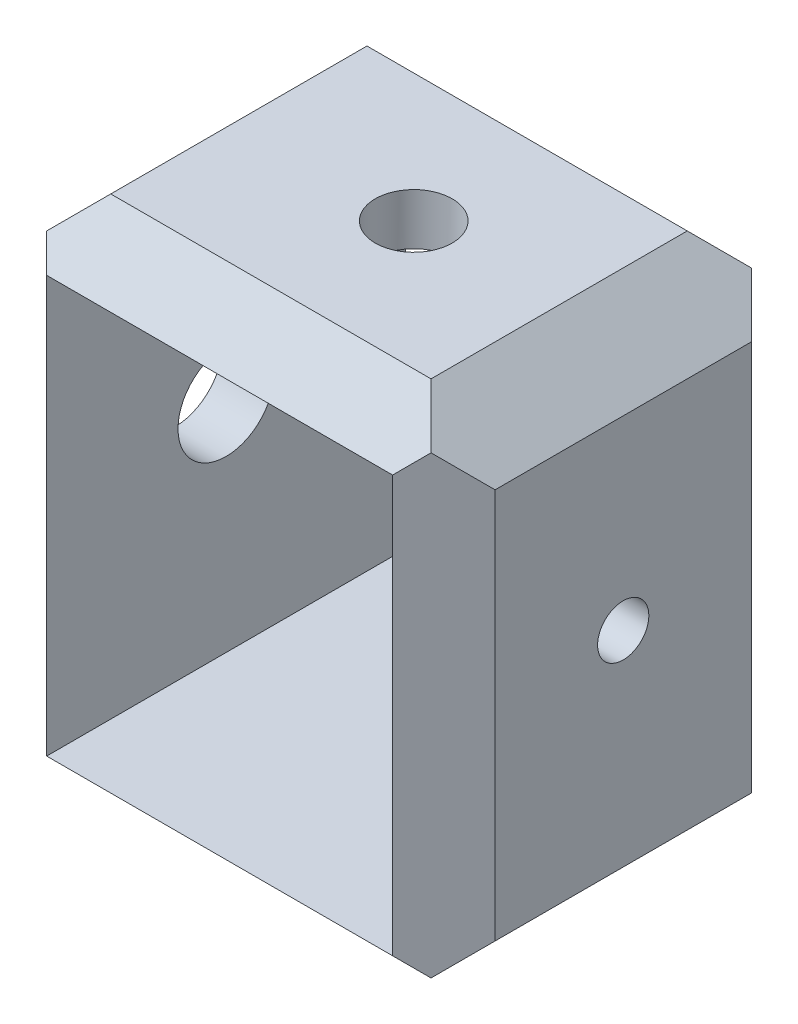
ISO-10303-21;
HEADER;
FILE_DESCRIPTION(('STEP AP214'),'2;1');
FILE_NAME('part.step','',(''),(''),'','','');
FILE_SCHEMA(('AUTOMOTIVE_DESIGN { 1 0 10303 214 1 1 1 1 }'));
ENDSEC;
DATA;
#1=APPLICATION_CONTEXT('core data for automotive mechanical design processes');
#2=APPLICATION_PROTOCOL_DEFINITION('international standard','automotive_design',2000,#1);
#3=PRODUCT_CONTEXT('',#1,'mechanical');
#4=PRODUCT('Part','Part','',(#3));
#5=PRODUCT_RELATED_PRODUCT_CATEGORY('part','',(#4));
#6=PRODUCT_DEFINITION_FORMATION('','',#4);
#7=PRODUCT_DEFINITION_CONTEXT('part definition',#1,'design');
#8=PRODUCT_DEFINITION('design','',#6,#7);
#9=PRODUCT_DEFINITION_SHAPE('','',#8);
#10=(LENGTH_UNIT() NAMED_UNIT(*) SI_UNIT(.MILLI.,.METRE.));
#11=(NAMED_UNIT(*) PLANE_ANGLE_UNIT() SI_UNIT($,.RADIAN.));
#12=(NAMED_UNIT(*) SI_UNIT($,.STERADIAN.) SOLID_ANGLE_UNIT());
#13=UNCERTAINTY_MEASURE_WITH_UNIT(LENGTH_MEASURE(1.E-05),#10,'distance_accuracy_value','');
#14=(GEOMETRIC_REPRESENTATION_CONTEXT(3) GLOBAL_UNCERTAINTY_ASSIGNED_CONTEXT((#13)) GLOBAL_UNIT_ASSIGNED_CONTEXT((#10,
#11,#12)) REPRESENTATION_CONTEXT('',''));
#15=CARTESIAN_POINT('',(0.,0.,0.));
#16=DIRECTION('',(0.,0.,1.));
#17=DIRECTION('',(1.,0.,0.));
#18=AXIS2_PLACEMENT_3D('',#15,#16,#17);
#19=CARTESIAN_POINT('',(-132.607692058621,195.,150.));
#20=DIRECTION('',(1.,0.,0.));
#21=DIRECTION('',(0.,1.,0.));
#22=AXIS2_PLACEMENT_3D('',#19,#20,#21);
#23=PLANE('',#22);
#24=CARTESIAN_POINT('',(-132.607692058621,0.,0.));
#25=DIRECTION('',(-1.,0.,0.));
#26=DIRECTION('',(0.,-1.,0.));
#27=AXIS2_PLACEMENT_3D('',#24,#25,#26);
#28=CIRCLE('',#27,37.5);
#29=CARTESIAN_POINT('',(-132.607692058621,-37.5,0.));
#30=VERTEX_POINT('',#29);
#31=EDGE_CURVE('E310',#30,#30,#28,.T.);
#32=ORIENTED_EDGE('',*,*,#31,.F.);
#33=EDGE_LOOP('',(#32));
#34=FACE_BOUND('',#33,.T.);
#35=DIRECTION('',(0.,0.,1.));
#36=VECTOR('',#35,1.);
#37=CARTESIAN_POINT('',(-132.607692058621,-160.,150.));
#38=LINE('',#37,#36);
#39=CARTESIAN_POINT('',(-132.607692058621,-160.,-99.9999999999991));
#40=VERTEX_POINT('',#39);
#41=CARTESIAN_POINT('',(-132.607692058621,-160.,99.9999999999996));
#42=VERTEX_POINT('',#41);
#43=EDGE_CURVE('E179',#40,#42,#38,.T.);
#44=ORIENTED_EDGE('',*,*,#43,.T.);
#45=DIRECTION('',(0.,1.,0.));
#46=VECTOR('',#45,1.);
#47=CARTESIAN_POINT('',(-132.607692058621,145.,99.9999999999996));
#48=LINE('',#47,#46);
#49=CARTESIAN_POINT('',(-132.607692058621,145.,99.9999999999996));
#50=VERTEX_POINT('',#49);
#51=EDGE_CURVE('E262',#42,#50,#48,.T.);
#52=ORIENTED_EDGE('',*,*,#51,.T.);
#53=DIRECTION('',(0.,0.,-1.));
#54=VECTOR('',#53,1.);
#55=CARTESIAN_POINT('',(-132.607692058621,145.,150.));
#56=LINE('',#55,#54);
#57=CARTESIAN_POINT('',(-132.607692058621,145.,-99.9999999999991));
#58=VERTEX_POINT('',#57);
#59=EDGE_CURVE('E177',#50,#58,#56,.T.);
#60=ORIENTED_EDGE('',*,*,#59,.T.);
#61=DIRECTION('',(0.,-1.,0.));
#62=VECTOR('',#61,1.);
#63=CARTESIAN_POINT('',(-132.607692058621,195.,-99.9999999999991));
#64=LINE('',#63,#62);
#65=EDGE_CURVE('E259',#58,#40,#64,.T.);
#66=ORIENTED_EDGE('',*,*,#65,.T.);
#67=EDGE_LOOP('',(#44,#52,#60,#66));
#68=FACE_BOUND('',#67,.T.);
#69=ADVANCED_FACE('F37',(#34,#68),#23,.F.);
#70=CARTESIAN_POINT('',(-132.607692058621,-210.,150.));
#71=DIRECTION('',(0.,1.,0.));
#72=DIRECTION('',(0.,0.,1.));
#73=AXIS2_PLACEMENT_3D('',#70,#71,#72);
#74=PLANE('',#73);
#75=DIRECTION('',(0.,0.,-1.));
#76=VECTOR('',#75,1.);
#77=CARTESIAN_POINT('',(-82.6076920586205,-210.,150.));
#78=LINE('',#77,#76);
#79=CARTESIAN_POINT('',(-82.6076920586205,-210.,99.9999999999996));
#80=VERTEX_POINT('',#79);
#81=CARTESIAN_POINT('',(-82.6076920586205,-210.,-99.9999999999991));
#82=VERTEX_POINT('',#81);
#83=EDGE_CURVE('E171',#80,#82,#78,.T.);
#84=ORIENTED_EDGE('',*,*,#83,.T.);
#85=DIRECTION('',(1.,0.,0.));
#86=VECTOR('',#85,1.);
#87=CARTESIAN_POINT('',(-132.607692058621,-210.,-99.9999999999991));
#88=LINE('',#87,#86);
#89=CARTESIAN_POINT('',(167.392307941379,-210.,-99.9999999999991));
#90=VERTEX_POINT('',#89);
#91=EDGE_CURVE('E154',#82,#90,#88,.T.);
#92=ORIENTED_EDGE('',*,*,#91,.T.);
#93=DIRECTION('',(0.,0.,1.));
#94=VECTOR('',#93,1.);
#95=CARTESIAN_POINT('',(167.392307941379,-210.,150.));
#96=LINE('',#95,#94);
#97=CARTESIAN_POINT('',(167.392307941379,-210.,99.9999999999996));
#98=VERTEX_POINT('',#97);
#99=EDGE_CURVE('E168',#90,#98,#96,.T.);
#100=ORIENTED_EDGE('',*,*,#99,.T.);
#101=DIRECTION('',(-1.,0.,0.));
#102=VECTOR('',#101,1.);
#103=CARTESIAN_POINT('',(-82.6076920586205,-210.,99.9999999999996));
#104=LINE('',#103,#102);
#105=EDGE_CURVE('E172',#98,#80,#104,.T.);
#106=ORIENTED_EDGE('',*,*,#105,.T.);
#107=EDGE_LOOP('',(#84,#92,#100,#106));
#108=FACE_BOUND('',#107,.T.);
#109=ADVANCED_FACE('F167',(#108),#74,.F.);
#110=CARTESIAN_POINT('',(217.392307941379,195.,150.));
#111=DIRECTION('',(-1.,0.,0.));
#112=DIRECTION('',(0.,-1.,0.));
#113=AXIS2_PLACEMENT_3D('',#110,#111,#112);
#114=PLANE('',#113);
#115=CARTESIAN_POINT('',(217.392307941379,0.,0.));
#116=DIRECTION('',(1.,0.,0.));
#117=DIRECTION('',(0.,1.,0.));
#118=AXIS2_PLACEMENT_3D('',#115,#116,#117);
#119=CIRCLE('',#118,20.);
#120=CARTESIAN_POINT('',(217.392307941379,20.,0.));
#121=VERTEX_POINT('',#120);
#122=EDGE_CURVE('E316',#121,#121,#119,.T.);
#123=ORIENTED_EDGE('',*,*,#122,.F.);
#124=EDGE_LOOP('',(#123));
#125=FACE_BOUND('',#124,.T.);
#126=DIRECTION('',(0.,0.,1.));
#127=VECTOR('',#126,1.);
#128=CARTESIAN_POINT('',(217.392307941379,145.,150.));
#129=LINE('',#128,#127);
#130=CARTESIAN_POINT('',(217.392307941379,145.,-99.9999999999991));
#131=VERTEX_POINT('',#130);
#132=CARTESIAN_POINT('',(217.392307941379,145.,99.9999999999996));
#133=VERTEX_POINT('',#132);
#134=EDGE_CURVE('E300',#131,#133,#129,.T.);
#135=ORIENTED_EDGE('',*,*,#134,.T.);
#136=DIRECTION('',(0.,-1.,0.));
#137=VECTOR('',#136,1.);
#138=CARTESIAN_POINT('',(217.392307941379,-160.,99.9999999999996));
#139=LINE('',#138,#137);
#140=CARTESIAN_POINT('',(217.392307941379,-160.,99.9999999999996));
#141=VERTEX_POINT('',#140);
#142=EDGE_CURVE('E240',#133,#141,#139,.T.);
#143=ORIENTED_EDGE('',*,*,#142,.T.);
#144=DIRECTION('',(0.,0.,-1.));
#145=VECTOR('',#144,1.);
#146=CARTESIAN_POINT('',(217.392307941379,-160.,150.));
#147=LINE('',#146,#145);
#148=CARTESIAN_POINT('',(217.392307941379,-160.,-99.9999999999991));
#149=VERTEX_POINT('',#148);
#150=EDGE_CURVE('E181',#141,#149,#147,.T.);
#151=ORIENTED_EDGE('',*,*,#150,.T.);
#152=DIRECTION('',(0.,1.,0.));
#153=VECTOR('',#152,1.);
#154=CARTESIAN_POINT('',(217.392307941379,195.,-99.9999999999991));
#155=LINE('',#154,#153);
#156=EDGE_CURVE('E237',#149,#131,#155,.T.);
#157=ORIENTED_EDGE('',*,*,#156,.T.);
#158=EDGE_LOOP('',(#135,#143,#151,#157));
#159=FACE_BOUND('',#158,.T.);
#160=ADVANCED_FACE('F297',(#125,#159),#114,.F.);
#161=CARTESIAN_POINT('',(-132.607692058621,195.,150.));
#162=DIRECTION('',(0.,-1.,0.));
#163=DIRECTION('',(1.,0.,0.));
#164=AXIS2_PLACEMENT_3D('',#161,#162,#163);
#165=PLANE('',#164);
#166=CARTESIAN_POINT('',(53.8823079413794,195.,0.));
#167=DIRECTION('',(0.,1.,0.));
#168=DIRECTION('',(0.,0.,1.));
#169=AXIS2_PLACEMENT_3D('',#166,#167,#168);
#170=CIRCLE('',#169,30.);
#171=CARTESIAN_POINT('',(53.8823079413794,195.,30.));
#172=VERTEX_POINT('',#171);
#173=EDGE_CURVE('E322',#172,#172,#170,.T.);
#174=ORIENTED_EDGE('',*,*,#173,.F.);
#175=EDGE_LOOP('',(#174));
#176=FACE_BOUND('',#175,.T.);
#177=DIRECTION('',(0.,0.,-1.));
#178=VECTOR('',#177,1.);
#179=CARTESIAN_POINT('',(167.392307941379,195.,150.));
#180=LINE('',#179,#178);
#181=CARTESIAN_POINT('',(167.392307941379,195.,99.9999999999996));
#182=VERTEX_POINT('',#181);
#183=CARTESIAN_POINT('',(167.392307941379,195.,-99.9999999999991));
#184=VERTEX_POINT('',#183);
#185=EDGE_CURVE('E190',#182,#184,#180,.T.);
#186=ORIENTED_EDGE('',*,*,#185,.T.);
#187=DIRECTION('',(-1.,0.,0.));
#188=VECTOR('',#187,1.);
#189=CARTESIAN_POINT('',(-132.607692058621,195.,-99.9999999999991));
#190=LINE('',#189,#188);
#191=CARTESIAN_POINT('',(-82.6076920586204,195.,-99.9999999999991));
#192=VERTEX_POINT('',#191);
#193=EDGE_CURVE('E207',#184,#192,#190,.T.);
#194=ORIENTED_EDGE('',*,*,#193,.T.);
#195=DIRECTION('',(0.,0.,1.));
#196=VECTOR('',#195,1.);
#197=CARTESIAN_POINT('',(-82.6076920586204,195.,150.));
#198=LINE('',#197,#196);
#199=CARTESIAN_POINT('',(-82.6076920586204,195.,99.9999999999996));
#200=VERTEX_POINT('',#199);
#201=EDGE_CURVE('E187',#192,#200,#198,.T.);
#202=ORIENTED_EDGE('',*,*,#201,.T.);
#203=DIRECTION('',(1.,0.,0.));
#204=VECTOR('',#203,1.);
#205=CARTESIAN_POINT('',(167.392307941379,195.,99.9999999999996));
#206=LINE('',#205,#204);
#207=EDGE_CURVE('E205',#200,#182,#206,.T.);
#208=ORIENTED_EDGE('',*,*,#207,.T.);
#209=EDGE_LOOP('',(#186,#194,#202,#208));
#210=FACE_BOUND('',#209,.T.);
#211=ADVANCED_FACE('F329',(#176,#210),#165,.F.);
#212=CARTESIAN_POINT('',(-92.6076920586205,155.,150.));
#213=DIRECTION('',(0.,-1.,0.));
#214=DIRECTION('',(0.,0.,-1.));
#215=AXIS2_PLACEMENT_3D('',#212,#213,#214);
#216=PLANE('',#215);
#217=CARTESIAN_POINT('',(53.8823079413794,155.,0.));
#218=DIRECTION('',(0.,-1.,0.));
#219=DIRECTION('',(0.,0.,-1.));
#220=AXIS2_PLACEMENT_3D('',#217,#218,#219);
#221=CIRCLE('',#220,30.);
#222=CARTESIAN_POINT('',(53.8823079413794,155.,-30.));
#223=VERTEX_POINT('',#222);
#224=EDGE_CURVE('E319',#223,#223,#221,.F.);
#225=ORIENTED_EDGE('',*,*,#224,.T.);
#226=EDGE_LOOP('',(#225));
#227=FACE_BOUND('',#226,.T.);
#228=DIRECTION('',(0.,0.,-1.));
#229=VECTOR('',#228,1.);
#230=CARTESIAN_POINT('',(-92.6076920586205,155.,150.));
#231=LINE('',#230,#229);
#232=CARTESIAN_POINT('',(-92.6076920586205,155.,139.999999999999));
#233=VERTEX_POINT('',#232);
#234=CARTESIAN_POINT('',(-92.6076920586205,155.,-140.));
#235=VERTEX_POINT('',#234);
#236=EDGE_CURVE('E284',#233,#235,#231,.T.);
#237=ORIENTED_EDGE('',*,*,#236,.T.);
#238=DIRECTION('',(-1.,0.,0.));
#239=VECTOR('',#238,1.);
#240=CARTESIAN_POINT('',(-92.6076920586205,155.,-140.));
#241=LINE('',#240,#239);
#242=CARTESIAN_POINT('',(177.392307941379,155.,-139.999999999999));
#243=VERTEX_POINT('',#242);
#244=EDGE_CURVE('E217',#235,#243,#241,.F.);
#245=ORIENTED_EDGE('',*,*,#244,.T.);
#246=DIRECTION('',(0.,0.,-1.));
#247=VECTOR('',#246,1.);
#248=CARTESIAN_POINT('',(177.392307941379,155.,150.));
#249=LINE('',#248,#247);
#250=CARTESIAN_POINT('',(177.392307941379,155.,139.999999999999));
#251=VERTEX_POINT('',#250);
#252=EDGE_CURVE('E281',#251,#243,#249,.T.);
#253=ORIENTED_EDGE('',*,*,#252,.F.);
#254=DIRECTION('',(-1.,0.,0.));
#255=VECTOR('',#254,1.);
#256=CARTESIAN_POINT('',(-92.6076920586205,155.,139.999999999999));
#257=LINE('',#256,#255);
#258=EDGE_CURVE('E214',#251,#233,#257,.T.);
#259=ORIENTED_EDGE('',*,*,#258,.T.);
#260=EDGE_LOOP('',(#237,#245,#253,#259));
#261=FACE_BOUND('',#260,.T.);
#262=ADVANCED_FACE('F280',(#227,#261),#216,.T.);
#263=CARTESIAN_POINT('',(-92.6076920586205,155.,150.));
#264=DIRECTION('',(1.,0.,0.));
#265=DIRECTION('',(0.,1.,0.));
#266=AXIS2_PLACEMENT_3D('',#263,#264,#265);
#267=PLANE('',#266);
#268=CARTESIAN_POINT('',(-92.6076920586205,0.,0.));
#269=DIRECTION('',(1.,0.,0.));
#270=DIRECTION('',(0.,1.,0.));
#271=AXIS2_PLACEMENT_3D('',#268,#269,#270);
#272=CIRCLE('',#271,37.5);
#273=CARTESIAN_POINT('',(-92.6076920586205,37.5,0.));
#274=VERTEX_POINT('',#273);
#275=EDGE_CURVE('E291',#274,#274,#272,.F.);
#276=ORIENTED_EDGE('',*,*,#275,.T.);
#277=EDGE_LOOP('',(#276));
#278=FACE_BOUND('',#277,.T.);
#279=ORIENTED_EDGE('',*,*,#236,.F.);
#280=DIRECTION('',(0.,-1.,0.));
#281=VECTOR('',#280,1.);
#282=CARTESIAN_POINT('',(-92.6076920586205,155.,139.999999999999));
#283=LINE('',#282,#281);
#284=CARTESIAN_POINT('',(-92.6076920586205,-170.,139.999999999999));
#285=VERTEX_POINT('',#284);
#286=EDGE_CURVE('E253',#233,#285,#283,.T.);
#287=ORIENTED_EDGE('',*,*,#286,.T.);
#288=DIRECTION('',(0.,0.,-1.));
#289=VECTOR('',#288,1.);
#290=CARTESIAN_POINT('',(-92.6076920586205,-170.,150.));
#291=LINE('',#290,#289);
#292=CARTESIAN_POINT('',(-92.6076920586205,-170.,-140.));
#293=VERTEX_POINT('',#292);
#294=EDGE_CURVE('E304',#285,#293,#291,.T.);
#295=ORIENTED_EDGE('',*,*,#294,.T.);
#296=DIRECTION('',(0.,-1.,0.));
#297=VECTOR('',#296,1.);
#298=CARTESIAN_POINT('',(-92.6076920586205,155.,-140.));
#299=LINE('',#298,#297);
#300=EDGE_CURVE('E251',#293,#235,#299,.F.);
#301=ORIENTED_EDGE('',*,*,#300,.T.);
#302=EDGE_LOOP('',(#279,#287,#295,#301));
#303=FACE_BOUND('',#302,.T.);
#304=ADVANCED_FACE('F361',(#278,#303),#267,.T.);
#305=CARTESIAN_POINT('',(-92.6076920586205,-170.,150.));
#306=DIRECTION('',(0.,1.,0.));
#307=DIRECTION('',(-1.,0.,0.));
#308=AXIS2_PLACEMENT_3D('',#305,#306,#307);
#309=PLANE('',#308);
#310=DIRECTION('',(0.,0.,-1.));
#311=VECTOR('',#310,1.);
#312=CARTESIAN_POINT('',(177.392307941379,-170.,150.));
#313=LINE('',#312,#311);
#314=CARTESIAN_POINT('',(177.392307941379,-170.,139.999999999999));
#315=VERTEX_POINT('',#314);
#316=CARTESIAN_POINT('',(177.392307941379,-170.,-140.));
#317=VERTEX_POINT('',#316);
#318=EDGE_CURVE('E290',#315,#317,#313,.T.);
#319=ORIENTED_EDGE('',*,*,#318,.T.);
#320=DIRECTION('',(1.,0.,0.));
#321=VECTOR('',#320,1.);
#322=CARTESIAN_POINT('',(-92.6076920586205,-170.,-140.));
#323=LINE('',#322,#321);
#324=EDGE_CURVE('E197',#317,#293,#323,.F.);
#325=ORIENTED_EDGE('',*,*,#324,.T.);
#326=ORIENTED_EDGE('',*,*,#294,.F.);
#327=DIRECTION('',(1.,0.,0.));
#328=VECTOR('',#327,1.);
#329=CARTESIAN_POINT('',(-92.6076920586205,-170.,139.999999999999));
#330=LINE('',#329,#328);
#331=EDGE_CURVE('E161',#285,#315,#330,.T.);
#332=ORIENTED_EDGE('',*,*,#331,.T.);
#333=EDGE_LOOP('',(#319,#325,#326,#332));
#334=FACE_BOUND('',#333,.T.);
#335=ADVANCED_FACE('F364',(#334),#309,.T.);
#336=CARTESIAN_POINT('',(177.392307941379,155.,150.));
#337=DIRECTION('',(-1.,0.,0.));
#338=DIRECTION('',(0.,-1.,0.));
#339=AXIS2_PLACEMENT_3D('',#336,#337,#338);
#340=PLANE('',#339);
#341=CARTESIAN_POINT('',(177.392307941379,0.,0.));
#342=DIRECTION('',(-1.,0.,0.));
#343=DIRECTION('',(0.,-1.,0.));
#344=AXIS2_PLACEMENT_3D('',#341,#342,#343);
#345=CIRCLE('',#344,20.);
#346=CARTESIAN_POINT('',(177.392307941379,-20.,0.));
#347=VERTEX_POINT('',#346);
#348=EDGE_CURVE('E313',#347,#347,#345,.F.);
#349=ORIENTED_EDGE('',*,*,#348,.T.);
#350=EDGE_LOOP('',(#349));
#351=FACE_BOUND('',#350,.T.);
#352=ORIENTED_EDGE('',*,*,#318,.F.);
#353=DIRECTION('',(0.,1.,0.));
#354=VECTOR('',#353,1.);
#355=CARTESIAN_POINT('',(177.392307941379,155.,139.999999999999));
#356=LINE('',#355,#354);
#357=EDGE_CURVE('E227',#315,#251,#356,.T.);
#358=ORIENTED_EDGE('',*,*,#357,.T.);
#359=ORIENTED_EDGE('',*,*,#252,.T.);
#360=DIRECTION('',(0.,1.,0.));
#361=VECTOR('',#360,1.);
#362=CARTESIAN_POINT('',(177.392307941379,155.,-140.));
#363=LINE('',#362,#361);
#364=EDGE_CURVE('E225',#243,#317,#363,.F.);
#365=ORIENTED_EDGE('',*,*,#364,.T.);
#366=EDGE_LOOP('',(#352,#358,#359,#365));
#367=FACE_BOUND('',#366,.T.);
#368=ADVANCED_FACE('F287',(#351,#367),#340,.T.);
#369=CARTESIAN_POINT('',(13.4583251193616,0.,0.));
#370=DIRECTION('',(-1.,0.,0.));
#371=DIRECTION('',(0.,-1.,0.));
#372=AXIS2_PLACEMENT_3D('',#369,#370,#371);
#373=CYLINDRICAL_SURFACE('',#372,37.5);
#374=ORIENTED_EDGE('',*,*,#31,.T.);
#375=EDGE_LOOP('',(#374));
#376=FACE_BOUND('',#375,.T.);
#377=ORIENTED_EDGE('',*,*,#275,.F.);
#378=EDGE_LOOP('',(#377));
#379=FACE_BOUND('',#378,.T.);
#380=ADVANCED_FACE('F402',(#376,#379),#373,.F.);
#381=CARTESIAN_POINT('',(120.823765446456,0.,0.));
#382=DIRECTION('',(1.,0.,0.));
#383=DIRECTION('',(0.,1.,0.));
#384=AXIS2_PLACEMENT_3D('',#381,#382,#383);
#385=CYLINDRICAL_SURFACE('',#384,20.);
#386=ORIENTED_EDGE('',*,*,#122,.T.);
#387=EDGE_LOOP('',(#386));
#388=FACE_BOUND('',#387,.T.);
#389=ORIENTED_EDGE('',*,*,#348,.F.);
#390=EDGE_LOOP('',(#389));
#391=FACE_BOUND('',#390,.T.);
#392=ADVANCED_FACE('F397',(#388,#391),#385,.F.);
#393=CARTESIAN_POINT('',(53.8823079413794,70.1471862576143,0.));
#394=DIRECTION('',(0.,1.,0.));
#395=DIRECTION('',(0.,0.,1.));
#396=AXIS2_PLACEMENT_3D('',#393,#394,#395);
#397=CYLINDRICAL_SURFACE('',#396,30.);
#398=ORIENTED_EDGE('',*,*,#173,.T.);
#399=EDGE_LOOP('',(#398));
#400=FACE_BOUND('',#399,.T.);
#401=ORIENTED_EDGE('',*,*,#224,.F.);
#402=EDGE_LOOP('',(#401));
#403=FACE_BOUND('',#402,.T.);
#404=ADVANCED_FACE('F326',(#400,#403),#397,.F.);
#405=CARTESIAN_POINT('',(217.392307941379,-160.,150.));
#406=DIRECTION('',(-0.707106781186547,0.707106781186548,0.));
#407=DIRECTION('',(0.,0.,-1.));
#408=AXIS2_PLACEMENT_3D('',#405,#406,#407);
#409=PLANE('',#408);
#410=ORIENTED_EDGE('',*,*,#150,.F.);
#411=DIRECTION('',(0.577350269189628,0.577350269189627,-0.577350269189622));
#412=VECTOR('',#411,1.);
#413=CARTESIAN_POINT('',(200.725641274713,-176.666666666667,116.666666666666));
#414=LINE('',#413,#412);
#415=CARTESIAN_POINT('',(192.392307941379,-185.,124.999999999999));
#416=VERTEX_POINT('',#415);
#417=EDGE_CURVE('E245',#141,#416,#414,.F.);
#418=ORIENTED_EDGE('',*,*,#417,.T.);
#419=DIRECTION('',(0.577350269189629,0.577350269189627,0.577350269189621));
#420=VECTOR('',#419,1.);
#421=CARTESIAN_POINT('',(217.39230794138,-160.,149.999999999999));
#422=LINE('',#421,#420);
#423=EDGE_CURVE('E162',#416,#98,#422,.F.);
#424=ORIENTED_EDGE('',*,*,#423,.T.);
#425=ORIENTED_EDGE('',*,*,#99,.F.);
#426=DIRECTION('',(0.577350269189625,0.577350269189623,-0.577350269189629));
#427=VECTOR('',#426,1.);
#428=CARTESIAN_POINT('',(117.392307941379,-260.,-49.9999999999985));
#429=LINE('',#428,#427);
#430=CARTESIAN_POINT('',(192.392307941379,-185.,-124.999999999999));
#431=VERTEX_POINT('',#430);
#432=EDGE_CURVE('E150',#90,#431,#429,.T.);
#433=ORIENTED_EDGE('',*,*,#432,.T.);
#434=DIRECTION('',(0.577350269189624,0.577350269189623,0.57735026918963));
#435=VECTOR('',#434,1.);
#436=CARTESIAN_POINT('',(300.725641274713,-76.6666666666667,-16.6666666666647));
#437=LINE('',#436,#435);
#438=EDGE_CURVE('E243',#431,#149,#437,.T.);
#439=ORIENTED_EDGE('',*,*,#438,.T.);
#440=EDGE_LOOP('',(#410,#418,#424,#425,#433,#439));
#441=FACE_BOUND('',#440,.T.);
#442=ADVANCED_FACE('F175',(#441),#409,.F.);
#443=CARTESIAN_POINT('',(-82.6076920586205,-210.,150.));
#444=DIRECTION('',(0.707106781186549,0.707106781186546,0.));
#445=DIRECTION('',(0.,0.,-1.));
#446=AXIS2_PLACEMENT_3D('',#443,#444,#445);
#447=PLANE('',#446);
#448=DIRECTION('',(0.577350269189627,-0.577350269189629,-0.577350269189622));
#449=VECTOR('',#448,1.);
#450=CARTESIAN_POINT('',(-99.2743587252872,-193.333333333333,116.666666666666));
#451=LINE('',#450,#449);
#452=CARTESIAN_POINT('',(-107.60769205862,-185.,124.999999999999));
#453=VERTEX_POINT('',#452);
#454=EDGE_CURVE('E200',#80,#453,#451,.F.);
#455=ORIENTED_EDGE('',*,*,#454,.T.);
#456=DIRECTION('',(0.577350269189627,-0.577350269189629,0.577350269189621));
#457=VECTOR('',#456,1.);
#458=CARTESIAN_POINT('',(-82.6076920586202,-210.,149.999999999999));
#459=LINE('',#458,#457);
#460=EDGE_CURVE('E257',#453,#42,#459,.F.);
#461=ORIENTED_EDGE('',*,*,#460,.T.);
#462=ORIENTED_EDGE('',*,*,#43,.F.);
#463=DIRECTION('',(0.577350269189623,-0.577350269189625,-0.577350269189629));
#464=VECTOR('',#463,1.);
#465=CARTESIAN_POINT('',(-182.60769205862,-110.,-49.9999999999986));
#466=LINE('',#465,#464);
#467=CARTESIAN_POINT('',(-107.607692058621,-185.,-124.999999999999));
#468=VERTEX_POINT('',#467);
#469=EDGE_CURVE('E255',#40,#468,#466,.T.);
#470=ORIENTED_EDGE('',*,*,#469,.T.);
#471=DIRECTION('',(0.577350269189623,-0.577350269189624,0.577350269189631));
#472=VECTOR('',#471,1.);
#473=CARTESIAN_POINT('',(0.725641274712724,-293.333333333334,-16.6666666666647));
#474=LINE('',#473,#472);
#475=EDGE_CURVE('E203',#468,#82,#474,.T.);
#476=ORIENTED_EDGE('',*,*,#475,.T.);
#477=ORIENTED_EDGE('',*,*,#83,.F.);
#478=EDGE_LOOP('',(#455,#461,#462,#470,#476,#477));
#479=FACE_BOUND('',#478,.T.);
#480=ADVANCED_FACE('F348',(#479),#447,.F.);
#481=CARTESIAN_POINT('',(167.392307941379,195.,150.));
#482=DIRECTION('',(-0.707106781186549,-0.707106781186546,0.));
#483=DIRECTION('',(0.,0.,-1.));
#484=AXIS2_PLACEMENT_3D('',#481,#482,#483);
#485=PLANE('',#484);
#486=DIRECTION('',(-0.577350269189626,0.577350269189628,-0.577350269189622));
#487=VECTOR('',#486,1.);
#488=CARTESIAN_POINT('',(184.058974608046,178.333333333333,116.666666666666));
#489=LINE('',#488,#487);
#490=CARTESIAN_POINT('',(192.392307941379,170.,124.999999999999));
#491=VERTEX_POINT('',#490);
#492=EDGE_CURVE('E220',#182,#491,#489,.F.);
#493=ORIENTED_EDGE('',*,*,#492,.T.);
#494=DIRECTION('',(-0.577350269189627,0.577350269189629,0.577350269189621));
#495=VECTOR('',#494,1.);
#496=CARTESIAN_POINT('',(167.392307941379,195.,149.999999999999));
#497=LINE('',#496,#495);
#498=EDGE_CURVE('E235',#491,#133,#497,.F.);
#499=ORIENTED_EDGE('',*,*,#498,.T.);
#500=ORIENTED_EDGE('',*,*,#134,.F.);
#501=DIRECTION('',(-0.577350269189623,0.577350269189625,-0.577350269189629));
#502=VECTOR('',#501,1.);
#503=CARTESIAN_POINT('',(267.392307941379,94.9999999999997,-49.9999999999986));
#504=LINE('',#503,#502);
#505=CARTESIAN_POINT('',(192.392307941379,170.,-124.999999999999));
#506=VERTEX_POINT('',#505);
#507=EDGE_CURVE('E233',#131,#506,#504,.T.);
#508=ORIENTED_EDGE('',*,*,#507,.T.);
#509=DIRECTION('',(-0.577350269189623,0.577350269189625,0.57735026918963));
#510=VECTOR('',#509,1.);
#511=CARTESIAN_POINT('',(84.0589746080462,278.333333333333,-16.6666666666647));
#512=LINE('',#511,#510);
#513=EDGE_CURVE('E223',#506,#184,#512,.T.);
#514=ORIENTED_EDGE('',*,*,#513,.T.);
#515=ORIENTED_EDGE('',*,*,#185,.F.);
#516=EDGE_LOOP('',(#493,#499,#500,#508,#514,#515));
#517=FACE_BOUND('',#516,.T.);
#518=ADVANCED_FACE('F372',(#517),#485,.F.);
#519=CARTESIAN_POINT('',(-132.607692058621,145.,150.));
#520=DIRECTION('',(0.707106781186546,-0.707106781186549,0.));
#521=DIRECTION('',(0.,0.,-1.));
#522=AXIS2_PLACEMENT_3D('',#519,#520,#521);
#523=PLANE('',#522);
#524=ORIENTED_EDGE('',*,*,#59,.F.);
#525=DIRECTION('',(-0.577350269189628,-0.577350269189626,-0.577350269189622));
#526=VECTOR('',#525,1.);
#527=CARTESIAN_POINT('',(-115.941025391954,161.666666666667,116.666666666666));
#528=LINE('',#527,#526);
#529=CARTESIAN_POINT('',(-107.607692058621,170.,124.999999999999));
#530=VERTEX_POINT('',#529);
#531=EDGE_CURVE('E266',#50,#530,#528,.F.);
#532=ORIENTED_EDGE('',*,*,#531,.T.);
#533=DIRECTION('',(-0.577350269189629,-0.577350269189627,0.577350269189621));
#534=VECTOR('',#533,1.);
#535=CARTESIAN_POINT('',(-132.607692058621,145.,149.999999999999));
#536=LINE('',#535,#534);
#537=EDGE_CURVE('E210',#530,#200,#536,.F.);
#538=ORIENTED_EDGE('',*,*,#537,.T.);
#539=ORIENTED_EDGE('',*,*,#201,.F.);
#540=DIRECTION('',(-0.577350269189625,-0.577350269189623,-0.577350269189629));
#541=VECTOR('',#540,1.);
#542=CARTESIAN_POINT('',(-32.6076920586202,245.,-49.9999999999986));
#543=LINE('',#542,#541);
#544=CARTESIAN_POINT('',(-107.607692058621,170.,-124.999999999999));
#545=VERTEX_POINT('',#544);
#546=EDGE_CURVE('E212',#192,#545,#543,.T.);
#547=ORIENTED_EDGE('',*,*,#546,.T.);
#548=DIRECTION('',(-0.577350269189624,-0.577350269189623,0.577350269189631));
#549=VECTOR('',#548,1.);
#550=CARTESIAN_POINT('',(-215.941025391954,61.6666666666668,-16.6666666666647));
#551=LINE('',#550,#549);
#552=EDGE_CURVE('E57',#545,#58,#551,.T.);
#553=ORIENTED_EDGE('',*,*,#552,.T.);
#554=EDGE_LOOP('',(#524,#532,#538,#539,#547,#553));
#555=FACE_BOUND('',#554,.T.);
#556=ADVANCED_FACE('F338',(#555),#523,.F.);
#557=CARTESIAN_POINT('',(-132.607692058621,-210.,-99.9999999999991));
#558=DIRECTION('',(0.,0.707106781186551,0.707106781186544));
#559=DIRECTION('',(1.,0.,0.));
#560=AXIS2_PLACEMENT_3D('',#557,#558,#559);
#561=PLANE('',#560);
#562=ORIENTED_EDGE('',*,*,#475,.F.);
#563=DIRECTION('',(0.577350269189624,0.577350269189624,-0.57735026918963));
#564=VECTOR('',#563,1.);
#565=CARTESIAN_POINT('',(-132.607692058621,-210.,-99.9999999999991));
#566=LINE('',#565,#564);
#567=EDGE_CURVE('E269',#468,#293,#566,.T.);
#568=ORIENTED_EDGE('',*,*,#567,.T.);
#569=ORIENTED_EDGE('',*,*,#324,.F.);
#570=DIRECTION('',(0.577350269189624,-0.577350269189624,0.57735026918963));
#571=VECTOR('',#570,1.);
#572=CARTESIAN_POINT('',(100.725641274714,-93.3333333333342,-216.666666666666));
#573=LINE('',#572,#571);
#574=EDGE_CURVE('E157',#317,#431,#573,.T.);
#575=ORIENTED_EDGE('',*,*,#574,.T.);
#576=ORIENTED_EDGE('',*,*,#432,.F.);
#577=ORIENTED_EDGE('',*,*,#91,.F.);
#578=EDGE_LOOP('',(#562,#568,#569,#575,#576,#577));
#579=FACE_BOUND('',#578,.T.);
#580=ADVANCED_FACE('F153',(#579),#561,.F.);
#581=CARTESIAN_POINT('',(-132.607692058621,195.,-99.9999999999991));
#582=DIRECTION('',(0.,-0.707106781186551,0.707106781186544));
#583=DIRECTION('',(-1.,0.,0.));
#584=AXIS2_PLACEMENT_3D('',#581,#582,#583);
#585=PLANE('',#584);
#586=ORIENTED_EDGE('',*,*,#244,.F.);
#587=DIRECTION('',(-0.577350269189624,0.577350269189624,0.57735026918963));
#588=VECTOR('',#587,1.);
#589=CARTESIAN_POINT('',(-132.607692058621,195.,-99.9999999999991));
#590=LINE('',#589,#588);
#591=EDGE_CURVE('E11',#235,#545,#590,.T.);
#592=ORIENTED_EDGE('',*,*,#591,.T.);
#593=ORIENTED_EDGE('',*,*,#546,.F.);
#594=ORIENTED_EDGE('',*,*,#193,.F.);
#595=ORIENTED_EDGE('',*,*,#513,.F.);
#596=DIRECTION('',(-0.577350269189624,-0.577350269189624,-0.57735026918963));
#597=VECTOR('',#596,1.);
#598=CARTESIAN_POINT('',(100.725641274714,78.3333333333341,-216.666666666666));
#599=LINE('',#598,#597);
#600=EDGE_CURVE('E45',#506,#243,#599,.T.);
#601=ORIENTED_EDGE('',*,*,#600,.T.);
#602=EDGE_LOOP('',(#586,#592,#593,#594,#595,#601));
#603=FACE_BOUND('',#602,.T.);
#604=ADVANCED_FACE('F272',(#603),#585,.F.);
#605=CARTESIAN_POINT('',(0.,144.999999999999,150.));
#606=DIRECTION('',(0.,0.707106781186544,0.707106781186551));
#607=DIRECTION('',(1.,0.,0.));
#608=AXIS2_PLACEMENT_3D('',#605,#606,#607);
#609=PLANE('',#608);
#610=ORIENTED_EDGE('',*,*,#258,.F.);
#611=DIRECTION('',(0.577350269189628,0.577350269189628,-0.577350269189622));
#612=VECTOR('',#611,1.);
#613=CARTESIAN_POINT('',(111.594871960919,89.2025640195392,205.797435980459));
#614=LINE('',#613,#612);
#615=EDGE_CURVE('E231',#251,#491,#614,.T.);
#616=ORIENTED_EDGE('',*,*,#615,.T.);
#617=ORIENTED_EDGE('',*,*,#492,.F.);
#618=ORIENTED_EDGE('',*,*,#207,.F.);
#619=ORIENTED_EDGE('',*,*,#537,.F.);
#620=DIRECTION('',(0.577350269189628,-0.577350269189628,0.577350269189622));
#621=VECTOR('',#620,1.);
#622=CARTESIAN_POINT('',(-55.0717947057462,117.464102647126,177.535897352873));
#623=LINE('',#622,#621);
#624=EDGE_CURVE('E229',#530,#233,#623,.T.);
#625=ORIENTED_EDGE('',*,*,#624,.T.);
#626=EDGE_LOOP('',(#610,#616,#617,#618,#619,#625));
#627=FACE_BOUND('',#626,.T.);
#628=ADVANCED_FACE('F358',(#627),#609,.T.);
#629=CARTESIAN_POINT('',(0.,-159.999999999999,150.));
#630=DIRECTION('',(0.,-0.707106781186544,0.707106781186551));
#631=DIRECTION('',(-1.,0.,0.));
#632=AXIS2_PLACEMENT_3D('',#629,#630,#631);
#633=PLANE('',#632);
#634=ORIENTED_EDGE('',*,*,#423,.F.);
#635=DIRECTION('',(-0.577350269189628,0.577350269189628,0.577350269189622));
#636=VECTOR('',#635,1.);
#637=CARTESIAN_POINT('',(111.594871960919,-104.202564019539,205.797435980459));
#638=LINE('',#637,#636);
#639=EDGE_CURVE('E249',#416,#315,#638,.T.);
#640=ORIENTED_EDGE('',*,*,#639,.T.);
#641=ORIENTED_EDGE('',*,*,#331,.F.);
#642=DIRECTION('',(-0.577350269189628,-0.577350269189628,-0.577350269189622));
#643=VECTOR('',#642,1.);
#644=CARTESIAN_POINT('',(-55.0717947057462,-132.464102647126,177.535897352873));
#645=LINE('',#644,#643);
#646=EDGE_CURVE('E247',#285,#453,#645,.T.);
#647=ORIENTED_EDGE('',*,*,#646,.T.);
#648=ORIENTED_EDGE('',*,*,#454,.F.);
#649=ORIENTED_EDGE('',*,*,#105,.F.);
#650=EDGE_LOOP('',(#634,#640,#641,#647,#648,#649));
#651=FACE_BOUND('',#650,.T.);
#652=ADVANCED_FACE('F366',(#651),#633,.T.);
#653=CARTESIAN_POINT('',(167.392307941379,0.,150.));
#654=DIRECTION('',(0.707106781186544,0.,0.707106781186551));
#655=DIRECTION('',(0.,-1.,0.));
#656=AXIS2_PLACEMENT_3D('',#653,#654,#655);
#657=PLANE('',#656);
#658=ORIENTED_EDGE('',*,*,#417,.F.);
#659=ORIENTED_EDGE('',*,*,#142,.F.);
#660=ORIENTED_EDGE('',*,*,#498,.F.);
#661=ORIENTED_EDGE('',*,*,#615,.F.);
#662=ORIENTED_EDGE('',*,*,#357,.F.);
#663=ORIENTED_EDGE('',*,*,#639,.F.);
#664=EDGE_LOOP('',(#658,#659,#660,#661,#662,#663));
#665=FACE_BOUND('',#664,.T.);
#666=ADVANCED_FACE('F369',(#665),#657,.T.);
#667=CARTESIAN_POINT('',(-82.6076920586196,0.,150.));
#668=DIRECTION('',(-0.707106781186544,0.,0.707106781186551));
#669=DIRECTION('',(0.,1.,0.));
#670=AXIS2_PLACEMENT_3D('',#667,#668,#669);
#671=PLANE('',#670);
#672=ORIENTED_EDGE('',*,*,#531,.F.);
#673=ORIENTED_EDGE('',*,*,#51,.F.);
#674=ORIENTED_EDGE('',*,*,#460,.F.);
#675=ORIENTED_EDGE('',*,*,#646,.F.);
#676=ORIENTED_EDGE('',*,*,#286,.F.);
#677=ORIENTED_EDGE('',*,*,#624,.F.);
#678=EDGE_LOOP('',(#672,#673,#674,#675,#676,#677));
#679=FACE_BOUND('',#678,.T.);
#680=ADVANCED_FACE('F353',(#679),#671,.T.);
#681=CARTESIAN_POINT('',(-132.607692058621,195.,-99.9999999999991));
#682=DIRECTION('',(0.707106781186551,0.,0.707106781186544));
#683=DIRECTION('',(0.,-1.,0.));
#684=AXIS2_PLACEMENT_3D('',#681,#682,#683);
#685=PLANE('',#684);
#686=ORIENTED_EDGE('',*,*,#591,.F.);
#687=ORIENTED_EDGE('',*,*,#300,.F.);
#688=ORIENTED_EDGE('',*,*,#567,.F.);
#689=ORIENTED_EDGE('',*,*,#469,.F.);
#690=ORIENTED_EDGE('',*,*,#65,.F.);
#691=ORIENTED_EDGE('',*,*,#552,.F.);
#692=EDGE_LOOP('',(#686,#687,#688,#689,#690,#691));
#693=FACE_BOUND('',#692,.T.);
#694=ADVANCED_FACE('F341',(#693),#685,.F.);
#695=CARTESIAN_POINT('',(217.392307941379,195.,-99.9999999999991));
#696=DIRECTION('',(-0.707106781186551,0.,0.707106781186544));
#697=DIRECTION('',(0.,1.,0.));
#698=AXIS2_PLACEMENT_3D('',#695,#696,#697);
#699=PLANE('',#698);
#700=ORIENTED_EDGE('',*,*,#574,.F.);
#701=ORIENTED_EDGE('',*,*,#364,.F.);
#702=ORIENTED_EDGE('',*,*,#600,.F.);
#703=ORIENTED_EDGE('',*,*,#507,.F.);
#704=ORIENTED_EDGE('',*,*,#156,.F.);
#705=ORIENTED_EDGE('',*,*,#438,.F.);
#706=EDGE_LOOP('',(#700,#701,#702,#703,#704,#705));
#707=FACE_BOUND('',#706,.T.);
#708=ADVANCED_FACE('F39',(#707),#699,.F.);
#709=CLOSED_SHELL('',(#69,#109,#160,#211,#262,#304,#335,#368,#380,#392,#404,#442,#480,#518,#556,
#580,#604,#628,#652,#666,#680,#694,#708));
#710=MANIFOLD_SOLID_BREP('B2',#709);
#711=ADVANCED_BREP_SHAPE_REPRESENTATION('',(#18,#710),#14);
#712=SHAPE_DEFINITION_REPRESENTATION(#9,#711);
ENDSEC;
END-ISO-10303-21;
